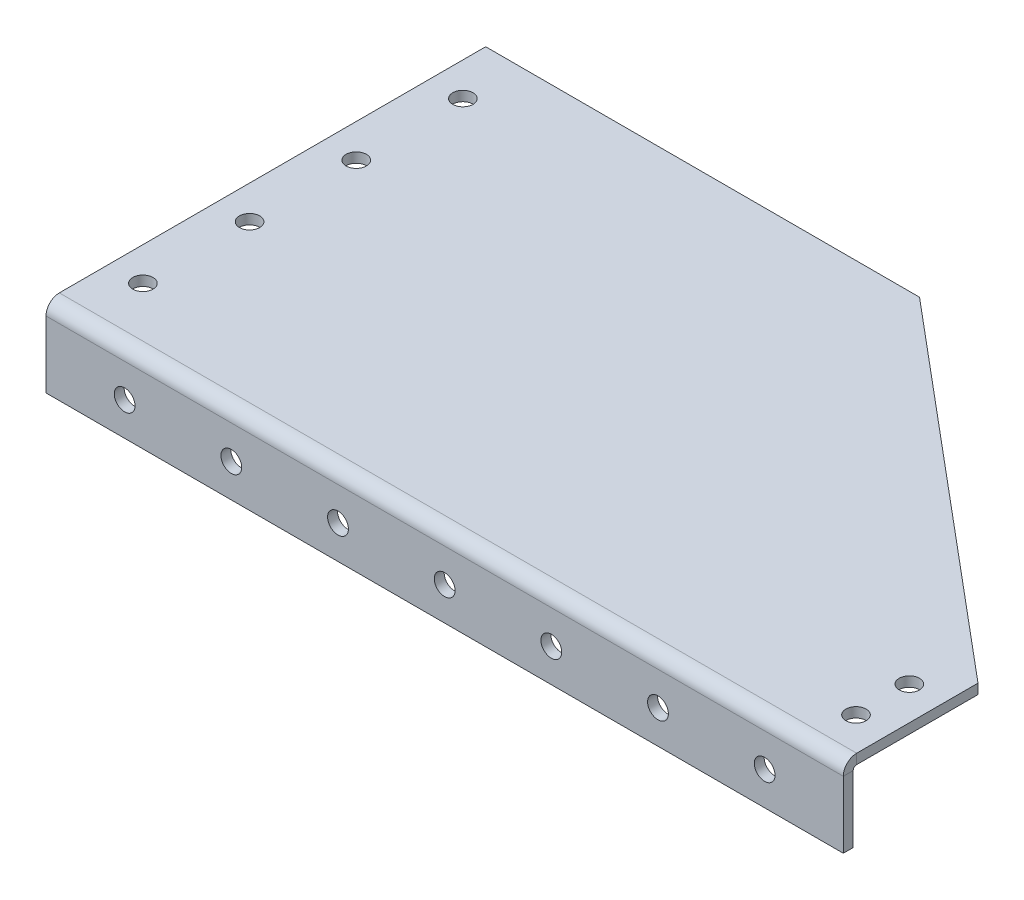
ISO-10303-21;
HEADER;
FILE_DESCRIPTION(('STEP AP214'),'2;1');
FILE_NAME('part.step','',(''),(''),'','','');
FILE_SCHEMA(('AUTOMOTIVE_DESIGN { 1 0 10303 214 1 1 1 1 }'));
ENDSEC;
DATA;
#1=APPLICATION_CONTEXT('core data for automotive mechanical design processes');
#2=APPLICATION_PROTOCOL_DEFINITION('international standard','automotive_design',2000,#1);
#3=PRODUCT_CONTEXT('',#1,'mechanical');
#4=PRODUCT('Part','Part','',(#3));
#5=PRODUCT_RELATED_PRODUCT_CATEGORY('part','',(#4));
#6=PRODUCT_DEFINITION_FORMATION('','',#4);
#7=PRODUCT_DEFINITION_CONTEXT('part definition',#1,'design');
#8=PRODUCT_DEFINITION('design','',#6,#7);
#9=PRODUCT_DEFINITION_SHAPE('','',#8);
#10=(LENGTH_UNIT() NAMED_UNIT(*) SI_UNIT(.MILLI.,.METRE.));
#11=(NAMED_UNIT(*) PLANE_ANGLE_UNIT() SI_UNIT($,.RADIAN.));
#12=(NAMED_UNIT(*) SI_UNIT($,.STERADIAN.) SOLID_ANGLE_UNIT());
#13=UNCERTAINTY_MEASURE_WITH_UNIT(LENGTH_MEASURE(1.E-05),#10,'distance_accuracy_value','');
#14=(GEOMETRIC_REPRESENTATION_CONTEXT(3) GLOBAL_UNCERTAINTY_ASSIGNED_CONTEXT((#13)) GLOBAL_UNIT_ASSIGNED_CONTEXT((#10,
#11,#12)) REPRESENTATION_CONTEXT('',''));
#15=CARTESIAN_POINT('',(0.,0.,0.));
#16=DIRECTION('',(0.,0.,1.));
#17=DIRECTION('',(1.,0.,0.));
#18=AXIS2_PLACEMENT_3D('',#15,#16,#17);
#19=CARTESIAN_POINT('',(-82.3158000000124,-2.3622,80.6769999999986));
#20=DIRECTION('',(-1.,0.,0.));
#21=DIRECTION('',(0.,0.,1.));
#22=AXIS2_PLACEMENT_3D('',#19,#20,#21);
#23=PLANE('',#22);
#24=DIRECTION('',(0.,0.,1.));
#25=VECTOR('',#24,1.);
#26=CARTESIAN_POINT('',(-82.3158000000124,0.,80.6769999999986));
#27=LINE('',#26,#25);
#28=CARTESIAN_POINT('',(-82.3158000000124,0.,-21.6596000000015));
#29=VERTEX_POINT('',#28);
#30=CARTESIAN_POINT('',(-82.3158000000124,0.,79.8641999999986));
#31=VERTEX_POINT('',#30);
#32=EDGE_CURVE('E195',#29,#31,#27,.T.);
#33=ORIENTED_EDGE('',*,*,#32,.F.);
#34=DIRECTION('',(0.,-1.,0.));
#35=VECTOR('',#34,1.);
#36=CARTESIAN_POINT('',(-82.3158000000124,0.,-21.6596000000015));
#37=LINE('',#36,#35);
#38=CARTESIAN_POINT('',(-82.3158000000124,-2.3622,-21.6596000000015));
#39=VERTEX_POINT('',#38);
#40=EDGE_CURVE('E123',#29,#39,#37,.T.);
#41=ORIENTED_EDGE('',*,*,#40,.T.);
#42=DIRECTION('',(0.,0.,1.));
#43=VECTOR('',#42,1.);
#44=CARTESIAN_POINT('',(-82.3158000000124,-2.3622,80.6769999999986));
#45=LINE('',#44,#43);
#46=CARTESIAN_POINT('',(-82.3158000000124,-2.36220000000001,79.8641999999985));
#47=VERTEX_POINT('',#46);
#48=EDGE_CURVE('E53',#39,#47,#45,.T.);
#49=ORIENTED_EDGE('',*,*,#48,.T.);
#50=DIRECTION('',(0.,1.,0.));
#51=VECTOR('',#50,1.);
#52=CARTESIAN_POINT('',(-82.3158000000124,-2.36220000000001,79.8641999999985));
#53=LINE('',#52,#51);
#54=EDGE_CURVE('E183',#47,#31,#53,.T.);
#55=ORIENTED_EDGE('',*,*,#54,.T.);
#56=EDGE_LOOP('',(#33,#41,#49,#55));
#57=FACE_BOUND('',#56,.T.);
#58=ADVANCED_FACE('F45',(#57),#23,.T.);
#59=CARTESIAN_POINT('',(0.,-2.3622,0.));
#60=DIRECTION('',(0.,1.,0.));
#61=DIRECTION('',(0.,0.,1.));
#62=AXIS2_PLACEMENT_3D('',#59,#60,#61);
#63=PLANE('',#62);
#64=CARTESIAN_POINT('',(-74.3402000000077,-2.3622,-8.2596000000015));
#65=DIRECTION('',(0.,-1.,0.));
#66=DIRECTION('',(0.,0.,-1.));
#67=AXIS2_PLACEMENT_3D('',#64,#65,#66);
#68=CIRCLE('',#67,2.413);
#69=CARTESIAN_POINT('',(-74.3402000000077,-2.3622,-10.6726000000015));
#70=VERTEX_POINT('',#69);
#71=EDGE_CURVE('E327',#70,#70,#68,.T.);
#72=ORIENTED_EDGE('',*,*,#71,.F.);
#73=EDGE_LOOP('',(#72));
#74=FACE_BOUND('',#73,.T.);
#75=CARTESIAN_POINT('',(99.5658000000081,-2.3622,72.0432000000004));
#76=DIRECTION('',(0.,-1.,0.));
#77=DIRECTION('',(0.,0.,-1.));
#78=AXIS2_PLACEMENT_3D('',#75,#76,#77);
#79=CIRCLE('',#78,2.41299999999999);
#80=CARTESIAN_POINT('',(99.5658000000081,-2.3622,69.6302000000004));
#81=VERTEX_POINT('',#80);
#82=EDGE_CURVE('E338',#81,#81,#79,.T.);
#83=ORIENTED_EDGE('',*,*,#82,.F.);
#84=EDGE_LOOP('',(#83));
#85=FACE_BOUND('',#84,.T.);
#86=CARTESIAN_POINT('',(99.5658000000083,-2.3622,59.3432000000004));
#87=DIRECTION('',(0.,-1.,0.));
#88=DIRECTION('',(0.,0.,-1.));
#89=AXIS2_PLACEMENT_3D('',#86,#87,#88);
#90=CIRCLE('',#89,2.41299999999999);
#91=CARTESIAN_POINT('',(99.5658000000083,-2.3622,56.9302000000004));
#92=VERTEX_POINT('',#91);
#93=EDGE_CURVE('E337',#92,#92,#90,.T.);
#94=ORIENTED_EDGE('',*,*,#93,.F.);
#95=EDGE_LOOP('',(#94));
#96=FACE_BOUND('',#95,.T.);
#97=CARTESIAN_POINT('',(-74.3402000000085,-2.3622,67.9403999999985));
#98=DIRECTION('',(0.,-1.,0.));
#99=DIRECTION('',(0.,0.,-1.));
#100=AXIS2_PLACEMENT_3D('',#97,#98,#99);
#101=CIRCLE('',#100,2.41299999999999);
#102=CARTESIAN_POINT('',(-74.3402000000085,-2.3622,65.5273999999985));
#103=VERTEX_POINT('',#102);
#104=EDGE_CURVE('E355',#103,#103,#101,.T.);
#105=ORIENTED_EDGE('',*,*,#104,.F.);
#106=EDGE_LOOP('',(#105));
#107=FACE_BOUND('',#106,.T.);
#108=CARTESIAN_POINT('',(-74.3402000000082,-2.3622,42.5403999999985));
#109=DIRECTION('',(0.,-1.,0.));
#110=DIRECTION('',(0.,0.,-1.));
#111=AXIS2_PLACEMENT_3D('',#108,#109,#110);
#112=CIRCLE('',#111,2.41299999999999);
#113=CARTESIAN_POINT('',(-74.3402000000082,-2.3622,40.1273999999985));
#114=VERTEX_POINT('',#113);
#115=EDGE_CURVE('E349',#114,#114,#112,.T.);
#116=ORIENTED_EDGE('',*,*,#115,.F.);
#117=EDGE_LOOP('',(#116));
#118=FACE_BOUND('',#117,.T.);
#119=CARTESIAN_POINT('',(-74.340200000008,-2.3622,17.1403999999985));
#120=DIRECTION('',(0.,-1.,0.));
#121=DIRECTION('',(0.,0.,-1.));
#122=AXIS2_PLACEMENT_3D('',#119,#120,#121);
#123=CIRCLE('',#122,2.413);
#124=CARTESIAN_POINT('',(-74.340200000008,-2.3622,14.7273999999985));
#125=VERTEX_POINT('',#124);
#126=EDGE_CURVE('E343',#125,#125,#123,.T.);
#127=ORIENTED_EDGE('',*,*,#126,.F.);
#128=EDGE_LOOP('',(#127));
#129=FACE_BOUND('',#128,.T.);
#130=DIRECTION('',(0.766044443118979,0.,0.642787609686538));
#131=VECTOR('',#130,1.);
#132=CARTESIAN_POINT('',(19.3372412522365,-2.3622,-23.0452267332139));
#133=LINE('',#132,#131);
#134=CARTESIAN_POINT('',(20.9885668895371,-2.3622,-21.6596000000015));
#135=VERTEX_POINT('',#134);
#136=CARTESIAN_POINT('',(107.54140000001,-2.3622,50.966850340345));
#137=VERTEX_POINT('',#136);
#138=EDGE_CURVE('E129',#135,#137,#133,.T.);
#139=ORIENTED_EDGE('',*,*,#138,.T.);
#140=DIRECTION('',(0.,0.,-1.));
#141=VECTOR('',#140,1.);
#142=CARTESIAN_POINT('',(107.54140000001,-2.3622,80.6769999999985));
#143=LINE('',#142,#141);
#144=CARTESIAN_POINT('',(107.54140000001,-2.36220000000001,79.8641999999985));
#145=VERTEX_POINT('',#144);
#146=EDGE_CURVE('E11',#145,#137,#143,.T.);
#147=ORIENTED_EDGE('',*,*,#146,.F.);
#148=DIRECTION('',(-1.,0.,0.));
#149=VECTOR('',#148,1.);
#150=CARTESIAN_POINT('',(-82.3158000000124,-2.36220000000001,79.8641999999985));
#151=LINE('',#150,#149);
#152=EDGE_CURVE('E189',#47,#145,#151,.F.);
#153=ORIENTED_EDGE('',*,*,#152,.F.);
#154=ORIENTED_EDGE('',*,*,#48,.F.);
#155=DIRECTION('',(1.,0.,0.));
#156=VECTOR('',#155,1.);
#157=CARTESIAN_POINT('',(0.,-2.3622,-21.6596000000015));
#158=LINE('',#157,#156);
#159=EDGE_CURVE('E136',#39,#135,#158,.T.);
#160=ORIENTED_EDGE('',*,*,#159,.T.);
#161=EDGE_LOOP('',(#139,#147,#153,#154,#160));
#162=FACE_BOUND('',#161,.T.);
#163=ADVANCED_FACE('F209',(#74,#85,#96,#107,#118,#129,#162),#63,.F.);
#164=CARTESIAN_POINT('',(0.,0.,0.));
#165=DIRECTION('',(0.,1.,0.));
#166=DIRECTION('',(0.,0.,1.));
#167=AXIS2_PLACEMENT_3D('',#164,#165,#166);
#168=PLANE('',#167);
#169=CARTESIAN_POINT('',(-74.3402000000077,0.,-8.2596000000015));
#170=DIRECTION('',(0.,1.,0.));
#171=DIRECTION('',(0.,0.,1.));
#172=AXIS2_PLACEMENT_3D('',#169,#170,#171);
#173=CIRCLE('',#172,2.413);
#174=CARTESIAN_POINT('',(-74.3402000000077,0.,-5.8466000000015));
#175=VERTEX_POINT('',#174);
#176=EDGE_CURVE('E325',#175,#175,#173,.F.);
#177=ORIENTED_EDGE('',*,*,#176,.T.);
#178=EDGE_LOOP('',(#177));
#179=FACE_BOUND('',#178,.T.);
#180=CARTESIAN_POINT('',(99.5658000000081,0.,72.0432000000004));
#181=DIRECTION('',(0.,1.,0.));
#182=DIRECTION('',(0.,0.,1.));
#183=AXIS2_PLACEMENT_3D('',#180,#181,#182);
#184=CIRCLE('',#183,2.41299999999999);
#185=CARTESIAN_POINT('',(99.5658000000081,0.,74.4562000000004));
#186=VERTEX_POINT('',#185);
#187=EDGE_CURVE('E334',#186,#186,#184,.F.);
#188=ORIENTED_EDGE('',*,*,#187,.T.);
#189=EDGE_LOOP('',(#188));
#190=FACE_BOUND('',#189,.T.);
#191=CARTESIAN_POINT('',(99.5658000000083,0.,59.3432000000004));
#192=DIRECTION('',(0.,1.,0.));
#193=DIRECTION('',(0.,0.,1.));
#194=AXIS2_PLACEMENT_3D('',#191,#192,#193);
#195=CIRCLE('',#194,2.41299999999999);
#196=CARTESIAN_POINT('',(99.5658000000083,0.,61.7562000000004));
#197=VERTEX_POINT('',#196);
#198=EDGE_CURVE('E358',#197,#197,#195,.F.);
#199=ORIENTED_EDGE('',*,*,#198,.T.);
#200=EDGE_LOOP('',(#199));
#201=FACE_BOUND('',#200,.T.);
#202=CARTESIAN_POINT('',(-74.3402000000085,0.,67.9403999999985));
#203=DIRECTION('',(0.,1.,0.));
#204=DIRECTION('',(0.,0.,1.));
#205=AXIS2_PLACEMENT_3D('',#202,#203,#204);
#206=CIRCLE('',#205,2.41299999999999);
#207=CARTESIAN_POINT('',(-74.3402000000085,0.,70.3533999999985));
#208=VERTEX_POINT('',#207);
#209=EDGE_CURVE('E352',#208,#208,#206,.F.);
#210=ORIENTED_EDGE('',*,*,#209,.T.);
#211=EDGE_LOOP('',(#210));
#212=FACE_BOUND('',#211,.T.);
#213=CARTESIAN_POINT('',(-74.3402000000082,0.,42.5403999999985));
#214=DIRECTION('',(0.,1.,0.));
#215=DIRECTION('',(0.,0.,1.));
#216=AXIS2_PLACEMENT_3D('',#213,#214,#215);
#217=CIRCLE('',#216,2.41299999999999);
#218=CARTESIAN_POINT('',(-74.3402000000082,0.,44.9533999999985));
#219=VERTEX_POINT('',#218);
#220=EDGE_CURVE('E346',#219,#219,#217,.F.);
#221=ORIENTED_EDGE('',*,*,#220,.T.);
#222=EDGE_LOOP('',(#221));
#223=FACE_BOUND('',#222,.T.);
#224=CARTESIAN_POINT('',(-74.340200000008,0.,17.1403999999985));
#225=DIRECTION('',(0.,1.,0.));
#226=DIRECTION('',(0.,0.,1.));
#227=AXIS2_PLACEMENT_3D('',#224,#225,#226);
#228=CIRCLE('',#227,2.413);
#229=CARTESIAN_POINT('',(-74.340200000008,0.,19.5533999999985));
#230=VERTEX_POINT('',#229);
#231=EDGE_CURVE('E331',#230,#230,#228,.F.);
#232=ORIENTED_EDGE('',*,*,#231,.T.);
#233=EDGE_LOOP('',(#232));
#234=FACE_BOUND('',#233,.T.);
#235=DIRECTION('',(0.,0.,-1.));
#236=VECTOR('',#235,1.);
#237=CARTESIAN_POINT('',(107.54140000001,0.,80.6769999999985));
#238=LINE('',#237,#236);
#239=CARTESIAN_POINT('',(107.54140000001,0.,79.8641999999985));
#240=VERTEX_POINT('',#239);
#241=CARTESIAN_POINT('',(107.54140000001,0.,50.966850340345));
#242=VERTEX_POINT('',#241);
#243=EDGE_CURVE('E48',#240,#242,#238,.T.);
#244=ORIENTED_EDGE('',*,*,#243,.T.);
#245=DIRECTION('',(0.766044443118979,0.,0.642787609686538));
#246=VECTOR('',#245,1.);
#247=CARTESIAN_POINT('',(19.3372412522365,0.,-23.0452267332139));
#248=LINE('',#247,#246);
#249=CARTESIAN_POINT('',(20.9885668895371,0.,-21.6596000000015));
#250=VERTEX_POINT('',#249);
#251=EDGE_CURVE('E61',#250,#242,#248,.T.);
#252=ORIENTED_EDGE('',*,*,#251,.F.);
#253=DIRECTION('',(1.,0.,0.));
#254=VECTOR('',#253,1.);
#255=CARTESIAN_POINT('',(0.,0.,-21.6596000000015));
#256=LINE('',#255,#254);
#257=EDGE_CURVE('E118',#29,#250,#256,.T.);
#258=ORIENTED_EDGE('',*,*,#257,.F.);
#259=ORIENTED_EDGE('',*,*,#32,.T.);
#260=DIRECTION('',(-1.,0.,0.));
#261=VECTOR('',#260,1.);
#262=CARTESIAN_POINT('',(-82.3158000000124,0.,79.8641999999986));
#263=LINE('',#262,#261);
#264=EDGE_CURVE('E179',#31,#240,#263,.F.);
#265=ORIENTED_EDGE('',*,*,#264,.T.);
#266=EDGE_LOOP('',(#244,#252,#258,#259,#265));
#267=FACE_BOUND('',#266,.T.);
#268=ADVANCED_FACE('F133',(#179,#190,#201,#212,#223,#234,#267),#168,.T.);
#269=CARTESIAN_POINT('',(107.54140000001,-2.3622,80.6769999999985));
#270=DIRECTION('',(1.,0.,0.));
#271=DIRECTION('',(0.,0.,-1.));
#272=AXIS2_PLACEMENT_3D('',#269,#270,#271);
#273=PLANE('',#272);
#274=ORIENTED_EDGE('',*,*,#146,.T.);
#275=DIRECTION('',(0.,-1.,0.));
#276=VECTOR('',#275,1.);
#277=CARTESIAN_POINT('',(107.54140000001,0.,50.966850340345));
#278=LINE('',#277,#276);
#279=EDGE_CURVE('E145',#242,#137,#278,.T.);
#280=ORIENTED_EDGE('',*,*,#279,.F.);
#281=ORIENTED_EDGE('',*,*,#243,.F.);
#282=DIRECTION('',(0.,1.,0.));
#283=VECTOR('',#282,1.);
#284=CARTESIAN_POINT('',(107.54140000001,-2.36220000000001,79.8641999999985));
#285=LINE('',#284,#283);
#286=EDGE_CURVE('E193',#145,#240,#285,.T.);
#287=ORIENTED_EDGE('',*,*,#286,.F.);
#288=EDGE_LOOP('',(#274,#280,#281,#287));
#289=FACE_BOUND('',#288,.T.);
#290=ADVANCED_FACE('F219',(#289),#273,.T.);
#291=CARTESIAN_POINT('',(107.54140000001,-3.175,79.8641999999985));
#292=DIRECTION('',(1.,0.,0.));
#293=DIRECTION('',(0.,0.,-1.));
#294=AXIS2_PLACEMENT_3D('',#291,#292,#293);
#295=PLANE('',#294);
#296=DIRECTION('',(0.,0.,1.));
#297=VECTOR('',#296,1.);
#298=CARTESIAN_POINT('',(107.54140000001,-3.175,80.6769999999985));
#299=LINE('',#298,#297);
#300=CARTESIAN_POINT('',(107.54140000001,-3.17499999999999,80.6769999999985));
#301=VERTEX_POINT('',#300);
#302=CARTESIAN_POINT('',(107.54140000001,-3.17499999999999,83.0391999999985));
#303=VERTEX_POINT('',#302);
#304=EDGE_CURVE('E147',#301,#303,#299,.T.);
#305=ORIENTED_EDGE('',*,*,#304,.F.);
#306=CARTESIAN_POINT('',(107.54140000001,-3.175,79.8641999999985));
#307=DIRECTION('',(-1.,0.,0.));
#308=DIRECTION('',(0.,0.,1.));
#309=AXIS2_PLACEMENT_3D('',#306,#307,#308);
#310=CIRCLE('',#309,0.812799999999989);
#311=EDGE_CURVE('E186',#145,#301,#310,.F.);
#312=ORIENTED_EDGE('',*,*,#311,.F.);
#313=ORIENTED_EDGE('',*,*,#286,.T.);
#314=CARTESIAN_POINT('',(107.54140000001,-3.175,79.8641999999985));
#315=DIRECTION('',(-1.,0.,0.));
#316=DIRECTION('',(0.,0.,1.));
#317=AXIS2_PLACEMENT_3D('',#314,#315,#316);
#318=CIRCLE('',#317,3.17499999999999);
#319=EDGE_CURVE('E69',#240,#303,#318,.F.);
#320=ORIENTED_EDGE('',*,*,#319,.T.);
#321=EDGE_LOOP('',(#305,#312,#313,#320));
#322=FACE_BOUND('',#321,.T.);
#323=ADVANCED_FACE('F217',(#322),#295,.T.);
#324=CARTESIAN_POINT('',(-82.3158000000124,-3.175,79.8641999999985));
#325=DIRECTION('',(1.,0.,0.));
#326=DIRECTION('',(0.,0.,-1.));
#327=AXIS2_PLACEMENT_3D('',#324,#325,#326);
#328=PLANE('',#327);
#329=CARTESIAN_POINT('',(-82.3158000000124,-3.175,79.8641999999985));
#330=DIRECTION('',(-1.,0.,0.));
#331=DIRECTION('',(0.,0.,1.));
#332=AXIS2_PLACEMENT_3D('',#329,#330,#331);
#333=CIRCLE('',#332,0.812799999999989);
#334=CARTESIAN_POINT('',(-82.3158000000124,-3.17499999999999,80.6769999999985));
#335=VERTEX_POINT('',#334);
#336=EDGE_CURVE('E178',#335,#47,#333,.T.);
#337=ORIENTED_EDGE('',*,*,#336,.F.);
#338=DIRECTION('',(0.,0.,1.));
#339=VECTOR('',#338,1.);
#340=CARTESIAN_POINT('',(-82.3158000000124,-3.175,80.6769999999986));
#341=LINE('',#340,#339);
#342=CARTESIAN_POINT('',(-82.3158000000124,-3.175,83.0391999999985));
#343=VERTEX_POINT('',#342);
#344=EDGE_CURVE('E151',#335,#343,#341,.T.);
#345=ORIENTED_EDGE('',*,*,#344,.T.);
#346=CARTESIAN_POINT('',(-82.3158000000124,-3.175,79.8641999999985));
#347=DIRECTION('',(-1.,0.,0.));
#348=DIRECTION('',(0.,0.,1.));
#349=AXIS2_PLACEMENT_3D('',#346,#347,#348);
#350=CIRCLE('',#349,3.17499999999999);
#351=EDGE_CURVE('E181',#343,#31,#350,.T.);
#352=ORIENTED_EDGE('',*,*,#351,.T.);
#353=ORIENTED_EDGE('',*,*,#54,.F.);
#354=EDGE_LOOP('',(#337,#345,#352,#353));
#355=FACE_BOUND('',#354,.T.);
#356=ADVANCED_FACE('F203',(#355),#328,.F.);
#357=CARTESIAN_POINT('',(-82.3158000000124,-3.175,79.8641999999985));
#358=DIRECTION('',(-1.,0.,0.));
#359=DIRECTION('',(0.,0.,1.));
#360=AXIS2_PLACEMENT_3D('',#357,#358,#359);
#361=CYLINDRICAL_SURFACE('',#360,3.17499999999999);
#362=ORIENTED_EDGE('',*,*,#264,.F.);
#363=ORIENTED_EDGE('',*,*,#351,.F.);
#364=DIRECTION('',(1.,0.,0.));
#365=VECTOR('',#364,1.);
#366=CARTESIAN_POINT('',(0.,-3.175,83.0391999999985));
#367=LINE('',#366,#365);
#368=EDGE_CURVE('E154',#343,#303,#367,.T.);
#369=ORIENTED_EDGE('',*,*,#368,.T.);
#370=ORIENTED_EDGE('',*,*,#319,.F.);
#371=EDGE_LOOP('',(#362,#363,#369,#370));
#372=FACE_BOUND('',#371,.T.);
#373=ADVANCED_FACE('F199',(#372),#361,.T.);
#374=CARTESIAN_POINT('',(-82.3158000000124,-3.175,79.8641999999985));
#375=DIRECTION('',(-1.,0.,0.));
#376=DIRECTION('',(0.,0.,1.));
#377=AXIS2_PLACEMENT_3D('',#374,#375,#376);
#378=CYLINDRICAL_SURFACE('',#377,0.812799999999989);
#379=ORIENTED_EDGE('',*,*,#152,.T.);
#380=ORIENTED_EDGE('',*,*,#311,.T.);
#381=DIRECTION('',(-1.,0.,0.));
#382=VECTOR('',#381,1.);
#383=CARTESIAN_POINT('',(107.54140000001,-3.175,80.6769999999985));
#384=LINE('',#383,#382);
#385=EDGE_CURVE('E149',#301,#335,#384,.T.);
#386=ORIENTED_EDGE('',*,*,#385,.T.);
#387=ORIENTED_EDGE('',*,*,#336,.T.);
#388=EDGE_LOOP('',(#379,#380,#386,#387));
#389=FACE_BOUND('',#388,.T.);
#390=ADVANCED_FACE('F213',(#389),#378,.F.);
#391=CARTESIAN_POINT('',(-82.3158000000124,-19.05,83.0391999999986));
#392=DIRECTION('',(1.,0.,0.));
#393=DIRECTION('',(0.,1.,0.));
#394=AXIS2_PLACEMENT_3D('',#391,#392,#393);
#395=PLANE('',#394);
#396=ORIENTED_EDGE('',*,*,#344,.F.);
#397=DIRECTION('',(0.,-1.,0.));
#398=VECTOR('',#397,1.);
#399=CARTESIAN_POINT('',(-82.3158000000124,-19.05,80.6769999999986));
#400=LINE('',#399,#398);
#401=CARTESIAN_POINT('',(-82.3158000000124,-19.05,80.6769999999986));
#402=VERTEX_POINT('',#401);
#403=EDGE_CURVE('E158',#335,#402,#400,.T.);
#404=ORIENTED_EDGE('',*,*,#403,.T.);
#405=DIRECTION('',(0.,0.,-1.));
#406=VECTOR('',#405,1.);
#407=CARTESIAN_POINT('',(-82.3158000000124,-19.05,83.0391999999986));
#408=LINE('',#407,#406);
#409=CARTESIAN_POINT('',(-82.3158000000124,-19.05,83.0391999999986));
#410=VERTEX_POINT('',#409);
#411=EDGE_CURVE('E175',#410,#402,#408,.T.);
#412=ORIENTED_EDGE('',*,*,#411,.F.);
#413=DIRECTION('',(0.,-1.,0.));
#414=VECTOR('',#413,1.);
#415=CARTESIAN_POINT('',(-82.3158000000124,-19.05,83.0391999999986));
#416=LINE('',#415,#414);
#417=EDGE_CURVE('E159',#343,#410,#416,.T.);
#418=ORIENTED_EDGE('',*,*,#417,.F.);
#419=EDGE_LOOP('',(#396,#404,#412,#418));
#420=FACE_BOUND('',#419,.T.);
#421=ADVANCED_FACE('F246',(#420),#395,.F.);
#422=CARTESIAN_POINT('',(107.54140000001,-2.36219999999999,83.0391999999985));
#423=DIRECTION('',(-1.,0.,0.));
#424=DIRECTION('',(0.,0.,1.));
#425=AXIS2_PLACEMENT_3D('',#422,#423,#424);
#426=PLANE('',#425);
#427=ORIENTED_EDGE('',*,*,#304,.T.);
#428=DIRECTION('',(0.,1.,0.));
#429=VECTOR('',#428,1.);
#430=CARTESIAN_POINT('',(107.54140000001,-2.36219999999999,83.0391999999985));
#431=LINE('',#430,#429);
#432=CARTESIAN_POINT('',(107.54140000001,-19.05,83.0391999999986));
#433=VERTEX_POINT('',#432);
#434=EDGE_CURVE('E164',#433,#303,#431,.T.);
#435=ORIENTED_EDGE('',*,*,#434,.F.);
#436=DIRECTION('',(0.,0.,-1.));
#437=VECTOR('',#436,1.);
#438=CARTESIAN_POINT('',(107.54140000001,-19.05,83.0391999999986));
#439=LINE('',#438,#437);
#440=CARTESIAN_POINT('',(107.54140000001,-19.05,80.6769999999986));
#441=VERTEX_POINT('',#440);
#442=EDGE_CURVE('E167',#433,#441,#439,.T.);
#443=ORIENTED_EDGE('',*,*,#442,.T.);
#444=DIRECTION('',(0.,1.,0.));
#445=VECTOR('',#444,1.);
#446=CARTESIAN_POINT('',(107.54140000001,-2.3622,80.6769999999985));
#447=LINE('',#446,#445);
#448=EDGE_CURVE('E162',#441,#301,#447,.T.);
#449=ORIENTED_EDGE('',*,*,#448,.T.);
#450=EDGE_LOOP('',(#427,#435,#443,#449));
#451=FACE_BOUND('',#450,.T.);
#452=ADVANCED_FACE('F251',(#451),#426,.F.);
#453=CARTESIAN_POINT('',(0.,2.76615675343239E-13,83.0391999999985));
#454=DIRECTION('',(0.,0.,-1.));
#455=DIRECTION('',(0.,1.,0.));
#456=AXIS2_PLACEMENT_3D('',#453,#454,#455);
#457=PLANE('',#456);
#458=CARTESIAN_POINT('',(-63.587200000001,-11.1125,83.0391999999986));
#459=DIRECTION('',(0.,0.,-1.));
#460=DIRECTION('',(0.,1.,0.));
#461=AXIS2_PLACEMENT_3D('',#458,#459,#460);
#462=CIRCLE('',#461,2.4765);
#463=CARTESIAN_POINT('',(-63.587200000001,-8.636,83.0391999999986));
#464=VERTEX_POINT('',#463);
#465=EDGE_CURVE('E143',#464,#464,#462,.F.);
#466=ORIENTED_EDGE('',*,*,#465,.F.);
#467=EDGE_LOOP('',(#466));
#468=FACE_BOUND('',#467,.T.);
#469=CARTESIAN_POINT('',(88.812799999999,-11.1125,83.0391999999986));
#470=DIRECTION('',(0.,0.,-1.));
#471=DIRECTION('',(0.,1.,0.));
#472=AXIS2_PLACEMENT_3D('',#469,#470,#471);
#473=CIRCLE('',#472,2.4765);
#474=CARTESIAN_POINT('',(88.812799999999,-8.636,83.0391999999985));
#475=VERTEX_POINT('',#474);
#476=EDGE_CURVE('E369',#475,#475,#473,.F.);
#477=ORIENTED_EDGE('',*,*,#476,.F.);
#478=EDGE_LOOP('',(#477));
#479=FACE_BOUND('',#478,.T.);
#480=CARTESIAN_POINT('',(63.412799999999,-11.1125,83.0391999999986));
#481=DIRECTION('',(0.,0.,-1.));
#482=DIRECTION('',(0.,1.,0.));
#483=AXIS2_PLACEMENT_3D('',#480,#481,#482);
#484=CIRCLE('',#483,2.4765);
#485=CARTESIAN_POINT('',(63.412799999999,-8.63600000000001,83.0391999999985));
#486=VERTEX_POINT('',#485);
#487=EDGE_CURVE('E375',#486,#486,#484,.F.);
#488=ORIENTED_EDGE('',*,*,#487,.F.);
#489=EDGE_LOOP('',(#488));
#490=FACE_BOUND('',#489,.T.);
#491=CARTESIAN_POINT('',(38.012799999999,-11.1125,83.0391999999986));
#492=DIRECTION('',(0.,0.,-1.));
#493=DIRECTION('',(0.,1.,0.));
#494=AXIS2_PLACEMENT_3D('',#491,#492,#493);
#495=CIRCLE('',#494,2.4765);
#496=CARTESIAN_POINT('',(38.012799999999,-8.63600000000001,83.0391999999985));
#497=VERTEX_POINT('',#496);
#498=EDGE_CURVE('E381',#497,#497,#495,.F.);
#499=ORIENTED_EDGE('',*,*,#498,.F.);
#500=EDGE_LOOP('',(#499));
#501=FACE_BOUND('',#500,.T.);
#502=CARTESIAN_POINT('',(12.612799999999,-11.1125,83.0391999999986));
#503=DIRECTION('',(0.,0.,-1.));
#504=DIRECTION('',(0.,1.,0.));
#505=AXIS2_PLACEMENT_3D('',#502,#503,#504);
#506=CIRCLE('',#505,2.4765);
#507=CARTESIAN_POINT('',(12.612799999999,-8.636,83.0391999999986));
#508=VERTEX_POINT('',#507);
#509=EDGE_CURVE('E387',#508,#508,#506,.F.);
#510=ORIENTED_EDGE('',*,*,#509,.F.);
#511=EDGE_LOOP('',(#510));
#512=FACE_BOUND('',#511,.T.);
#513=CARTESIAN_POINT('',(-12.787200000001,-11.1125,83.0391999999986));
#514=DIRECTION('',(0.,0.,-1.));
#515=DIRECTION('',(0.,1.,0.));
#516=AXIS2_PLACEMENT_3D('',#513,#514,#515);
#517=CIRCLE('',#516,2.4765);
#518=CARTESIAN_POINT('',(-12.787200000001,-8.636,83.0391999999986));
#519=VERTEX_POINT('',#518);
#520=EDGE_CURVE('E393',#519,#519,#517,.F.);
#521=ORIENTED_EDGE('',*,*,#520,.F.);
#522=EDGE_LOOP('',(#521));
#523=FACE_BOUND('',#522,.T.);
#524=CARTESIAN_POINT('',(-38.187200000001,-11.1125,83.0391999999986));
#525=DIRECTION('',(0.,0.,-1.));
#526=DIRECTION('',(0.,1.,0.));
#527=AXIS2_PLACEMENT_3D('',#524,#525,#526);
#528=CIRCLE('',#527,2.4765);
#529=CARTESIAN_POINT('',(-38.187200000001,-8.63600000000001,83.0391999999986));
#530=VERTEX_POINT('',#529);
#531=EDGE_CURVE('E328',#530,#530,#528,.F.);
#532=ORIENTED_EDGE('',*,*,#531,.F.);
#533=EDGE_LOOP('',(#532));
#534=FACE_BOUND('',#533,.T.);
#535=ORIENTED_EDGE('',*,*,#368,.F.);
#536=ORIENTED_EDGE('',*,*,#417,.T.);
#537=DIRECTION('',(1.,0.,0.));
#538=VECTOR('',#537,1.);
#539=CARTESIAN_POINT('',(107.54140000001,-19.05,83.0391999999986));
#540=LINE('',#539,#538);
#541=EDGE_CURVE('E161',#410,#433,#540,.T.);
#542=ORIENTED_EDGE('',*,*,#541,.T.);
#543=ORIENTED_EDGE('',*,*,#434,.T.);
#544=EDGE_LOOP('',(#535,#536,#542,#543));
#545=FACE_BOUND('',#544,.T.);
#546=ADVANCED_FACE('F259',(#468,#479,#490,#501,#512,#523,#534,#545),#457,.F.);
#547=CARTESIAN_POINT('',(0.,2.68368098124624E-13,80.6769999999985));
#548=DIRECTION('',(0.,0.,-1.));
#549=DIRECTION('',(0.,1.,0.));
#550=AXIS2_PLACEMENT_3D('',#547,#548,#549);
#551=PLANE('',#550);
#552=CARTESIAN_POINT('',(-63.587200000001,-11.1125,80.6769999999986));
#553=DIRECTION('',(0.,0.,-1.));
#554=DIRECTION('',(0.,1.,0.));
#555=AXIS2_PLACEMENT_3D('',#552,#553,#554);
#556=CIRCLE('',#555,2.4765);
#557=CARTESIAN_POINT('',(-63.587200000001,-8.63600000000001,80.6769999999986));
#558=VERTEX_POINT('',#557);
#559=EDGE_CURVE('E363',#558,#558,#556,.T.);
#560=ORIENTED_EDGE('',*,*,#559,.F.);
#561=EDGE_LOOP('',(#560));
#562=FACE_BOUND('',#561,.T.);
#563=CARTESIAN_POINT('',(88.812799999999,-11.1125,80.6769999999986));
#564=DIRECTION('',(0.,0.,-1.));
#565=DIRECTION('',(0.,1.,0.));
#566=AXIS2_PLACEMENT_3D('',#563,#564,#565);
#567=CIRCLE('',#566,2.4765);
#568=CARTESIAN_POINT('',(88.812799999999,-8.63600000000001,80.6769999999986));
#569=VERTEX_POINT('',#568);
#570=EDGE_CURVE('E366',#569,#569,#567,.T.);
#571=ORIENTED_EDGE('',*,*,#570,.F.);
#572=EDGE_LOOP('',(#571));
#573=FACE_BOUND('',#572,.T.);
#574=CARTESIAN_POINT('',(63.412799999999,-11.1125,80.6769999999986));
#575=DIRECTION('',(0.,0.,-1.));
#576=DIRECTION('',(0.,1.,0.));
#577=AXIS2_PLACEMENT_3D('',#574,#575,#576);
#578=CIRCLE('',#577,2.4765);
#579=CARTESIAN_POINT('',(63.412799999999,-8.63600000000002,80.6769999999986));
#580=VERTEX_POINT('',#579);
#581=EDGE_CURVE('E372',#580,#580,#578,.T.);
#582=ORIENTED_EDGE('',*,*,#581,.F.);
#583=EDGE_LOOP('',(#582));
#584=FACE_BOUND('',#583,.T.);
#585=CARTESIAN_POINT('',(38.012799999999,-11.1125,80.6769999999986));
#586=DIRECTION('',(0.,0.,-1.));
#587=DIRECTION('',(0.,1.,0.));
#588=AXIS2_PLACEMENT_3D('',#585,#586,#587);
#589=CIRCLE('',#588,2.4765);
#590=CARTESIAN_POINT('',(38.012799999999,-8.63600000000002,80.6769999999986));
#591=VERTEX_POINT('',#590);
#592=EDGE_CURVE('E378',#591,#591,#589,.T.);
#593=ORIENTED_EDGE('',*,*,#592,.F.);
#594=EDGE_LOOP('',(#593));
#595=FACE_BOUND('',#594,.T.);
#596=CARTESIAN_POINT('',(12.612799999999,-11.1125,80.6769999999986));
#597=DIRECTION('',(0.,0.,-1.));
#598=DIRECTION('',(0.,1.,0.));
#599=AXIS2_PLACEMENT_3D('',#596,#597,#598);
#600=CIRCLE('',#599,2.4765);
#601=CARTESIAN_POINT('',(12.612799999999,-8.63600000000001,80.6769999999986));
#602=VERTEX_POINT('',#601);
#603=EDGE_CURVE('E384',#602,#602,#600,.T.);
#604=ORIENTED_EDGE('',*,*,#603,.F.);
#605=EDGE_LOOP('',(#604));
#606=FACE_BOUND('',#605,.T.);
#607=CARTESIAN_POINT('',(-12.787200000001,-11.1125,80.6769999999986));
#608=DIRECTION('',(0.,0.,-1.));
#609=DIRECTION('',(0.,1.,0.));
#610=AXIS2_PLACEMENT_3D('',#607,#608,#609);
#611=CIRCLE('',#610,2.4765);
#612=CARTESIAN_POINT('',(-12.787200000001,-8.63600000000001,80.6769999999986));
#613=VERTEX_POINT('',#612);
#614=EDGE_CURVE('E390',#613,#613,#611,.T.);
#615=ORIENTED_EDGE('',*,*,#614,.F.);
#616=EDGE_LOOP('',(#615));
#617=FACE_BOUND('',#616,.T.);
#618=CARTESIAN_POINT('',(-38.187200000001,-11.1125,80.6769999999986));
#619=DIRECTION('',(0.,0.,-1.));
#620=DIRECTION('',(0.,1.,0.));
#621=AXIS2_PLACEMENT_3D('',#618,#619,#620);
#622=CIRCLE('',#621,2.4765);
#623=CARTESIAN_POINT('',(-38.187200000001,-8.63600000000002,80.6769999999986));
#624=VERTEX_POINT('',#623);
#625=EDGE_CURVE('E140',#624,#624,#622,.T.);
#626=ORIENTED_EDGE('',*,*,#625,.F.);
#627=EDGE_LOOP('',(#626));
#628=FACE_BOUND('',#627,.T.);
#629=ORIENTED_EDGE('',*,*,#403,.F.);
#630=ORIENTED_EDGE('',*,*,#385,.F.);
#631=ORIENTED_EDGE('',*,*,#448,.F.);
#632=DIRECTION('',(1.,0.,0.));
#633=VECTOR('',#632,1.);
#634=CARTESIAN_POINT('',(107.54140000001,-19.05,80.6769999999986));
#635=LINE('',#634,#633);
#636=EDGE_CURVE('E169',#402,#441,#635,.T.);
#637=ORIENTED_EDGE('',*,*,#636,.F.);
#638=EDGE_LOOP('',(#629,#630,#631,#637));
#639=FACE_BOUND('',#638,.T.);
#640=ADVANCED_FACE('F255',(#562,#573,#584,#595,#606,#617,#628,#639),#551,.T.);
#641=CARTESIAN_POINT('',(107.54140000001,-19.05,83.0391999999986));
#642=DIRECTION('',(0.,1.,0.));
#643=DIRECTION('',(0.,0.,1.));
#644=AXIS2_PLACEMENT_3D('',#641,#642,#643);
#645=PLANE('',#644);
#646=ORIENTED_EDGE('',*,*,#636,.T.);
#647=ORIENTED_EDGE('',*,*,#442,.F.);
#648=ORIENTED_EDGE('',*,*,#541,.F.);
#649=ORIENTED_EDGE('',*,*,#411,.T.);
#650=EDGE_LOOP('',(#646,#647,#648,#649));
#651=FACE_BOUND('',#650,.T.);
#652=ADVANCED_FACE('F253',(#651),#645,.F.);
#653=CARTESIAN_POINT('',(19.3372412522365,0.,-23.0452267332139));
#654=DIRECTION('',(0.642787609686538,0.,-0.766044443118979));
#655=DIRECTION('',(-0.766044443118979,0.,-0.642787609686538));
#656=AXIS2_PLACEMENT_3D('',#653,#654,#655);
#657=PLANE('',#656);
#658=ORIENTED_EDGE('',*,*,#138,.F.);
#659=DIRECTION('',(0.,-1.,0.));
#660=VECTOR('',#659,1.);
#661=CARTESIAN_POINT('',(20.9885668895371,0.,-21.6596000000015));
#662=LINE('',#661,#660);
#663=EDGE_CURVE('E120',#250,#135,#662,.T.);
#664=ORIENTED_EDGE('',*,*,#663,.F.);
#665=ORIENTED_EDGE('',*,*,#251,.T.);
#666=ORIENTED_EDGE('',*,*,#279,.T.);
#667=EDGE_LOOP('',(#658,#664,#665,#666));
#668=FACE_BOUND('',#667,.T.);
#669=ADVANCED_FACE('F127',(#668),#657,.T.);
#670=CARTESIAN_POINT('',(0.,0.,-21.6596000000015));
#671=DIRECTION('',(0.,0.,-1.));
#672=DIRECTION('',(-1.,0.,0.));
#673=AXIS2_PLACEMENT_3D('',#670,#671,#672);
#674=PLANE('',#673);
#675=ORIENTED_EDGE('',*,*,#159,.F.);
#676=ORIENTED_EDGE('',*,*,#40,.F.);
#677=ORIENTED_EDGE('',*,*,#257,.T.);
#678=ORIENTED_EDGE('',*,*,#663,.T.);
#679=EDGE_LOOP('',(#675,#676,#677,#678));
#680=FACE_BOUND('',#679,.T.);
#681=ADVANCED_FACE('F119',(#680),#674,.T.);
#682=CARTESIAN_POINT('',(-38.187200000001,-11.1125,83.0401999999987));
#683=DIRECTION('',(0.,0.,-1.));
#684=DIRECTION('',(0.,1.,0.));
#685=AXIS2_PLACEMENT_3D('',#682,#683,#684);
#686=CYLINDRICAL_SURFACE('',#685,2.4765);
#687=ORIENTED_EDGE('',*,*,#625,.T.);
#688=EDGE_LOOP('',(#687));
#689=FACE_BOUND('',#688,.T.);
#690=ORIENTED_EDGE('',*,*,#531,.T.);
#691=EDGE_LOOP('',(#690));
#692=FACE_BOUND('',#691,.T.);
#693=ADVANCED_FACE('F270',(#689,#692),#686,.F.);
#694=CARTESIAN_POINT('',(-12.787200000001,-11.1125,83.0401999999987));
#695=DIRECTION('',(0.,0.,-1.));
#696=DIRECTION('',(0.,1.,0.));
#697=AXIS2_PLACEMENT_3D('',#694,#695,#696);
#698=CYLINDRICAL_SURFACE('',#697,2.4765);
#699=ORIENTED_EDGE('',*,*,#614,.T.);
#700=EDGE_LOOP('',(#699));
#701=FACE_BOUND('',#700,.T.);
#702=ORIENTED_EDGE('',*,*,#520,.T.);
#703=EDGE_LOOP('',(#702));
#704=FACE_BOUND('',#703,.T.);
#705=ADVANCED_FACE('F273',(#701,#704),#698,.F.);
#706=CARTESIAN_POINT('',(12.612799999999,-11.1125,83.0401999999987));
#707=DIRECTION('',(0.,0.,-1.));
#708=DIRECTION('',(0.,1.,0.));
#709=AXIS2_PLACEMENT_3D('',#706,#707,#708);
#710=CYLINDRICAL_SURFACE('',#709,2.4765);
#711=ORIENTED_EDGE('',*,*,#603,.T.);
#712=EDGE_LOOP('',(#711));
#713=FACE_BOUND('',#712,.T.);
#714=ORIENTED_EDGE('',*,*,#509,.T.);
#715=EDGE_LOOP('',(#714));
#716=FACE_BOUND('',#715,.T.);
#717=ADVANCED_FACE('F277',(#713,#716),#710,.F.);
#718=CARTESIAN_POINT('',(38.012799999999,-11.1125,83.0401999999987));
#719=DIRECTION('',(0.,0.,-1.));
#720=DIRECTION('',(0.,1.,0.));
#721=AXIS2_PLACEMENT_3D('',#718,#719,#720);
#722=CYLINDRICAL_SURFACE('',#721,2.4765);
#723=ORIENTED_EDGE('',*,*,#592,.T.);
#724=EDGE_LOOP('',(#723));
#725=FACE_BOUND('',#724,.T.);
#726=ORIENTED_EDGE('',*,*,#498,.T.);
#727=EDGE_LOOP('',(#726));
#728=FACE_BOUND('',#727,.T.);
#729=ADVANCED_FACE('F281',(#725,#728),#722,.F.);
#730=CARTESIAN_POINT('',(63.412799999999,-11.1125,83.0401999999987));
#731=DIRECTION('',(0.,0.,-1.));
#732=DIRECTION('',(0.,1.,0.));
#733=AXIS2_PLACEMENT_3D('',#730,#731,#732);
#734=CYLINDRICAL_SURFACE('',#733,2.4765);
#735=ORIENTED_EDGE('',*,*,#581,.T.);
#736=EDGE_LOOP('',(#735));
#737=FACE_BOUND('',#736,.T.);
#738=ORIENTED_EDGE('',*,*,#487,.T.);
#739=EDGE_LOOP('',(#738));
#740=FACE_BOUND('',#739,.T.);
#741=ADVANCED_FACE('F285',(#737,#740),#734,.F.);
#742=CARTESIAN_POINT('',(88.812799999999,-11.1125,83.0401999999987));
#743=DIRECTION('',(0.,0.,-1.));
#744=DIRECTION('',(0.,1.,0.));
#745=AXIS2_PLACEMENT_3D('',#742,#743,#744);
#746=CYLINDRICAL_SURFACE('',#745,2.4765);
#747=ORIENTED_EDGE('',*,*,#570,.T.);
#748=EDGE_LOOP('',(#747));
#749=FACE_BOUND('',#748,.T.);
#750=ORIENTED_EDGE('',*,*,#476,.T.);
#751=EDGE_LOOP('',(#750));
#752=FACE_BOUND('',#751,.T.);
#753=ADVANCED_FACE('F289',(#749,#752),#746,.F.);
#754=CARTESIAN_POINT('',(-63.587200000001,-11.1125,83.0401999999987));
#755=DIRECTION('',(0.,0.,-1.));
#756=DIRECTION('',(0.,1.,0.));
#757=AXIS2_PLACEMENT_3D('',#754,#755,#756);
#758=CYLINDRICAL_SURFACE('',#757,2.4765);
#759=ORIENTED_EDGE('',*,*,#559,.T.);
#760=EDGE_LOOP('',(#759));
#761=FACE_BOUND('',#760,.T.);
#762=ORIENTED_EDGE('',*,*,#465,.T.);
#763=EDGE_LOOP('',(#762));
#764=FACE_BOUND('',#763,.T.);
#765=ADVANCED_FACE('F293',(#761,#764),#758,.F.);
#766=CARTESIAN_POINT('',(-74.340200000008,0.00100000000000013,17.1403999999985));
#767=DIRECTION('',(0.,-1.,0.));
#768=DIRECTION('',(0.,0.,-1.));
#769=AXIS2_PLACEMENT_3D('',#766,#767,#768);
#770=CYLINDRICAL_SURFACE('',#769,2.413);
#771=ORIENTED_EDGE('',*,*,#231,.F.);
#772=EDGE_LOOP('',(#771));
#773=FACE_BOUND('',#772,.T.);
#774=ORIENTED_EDGE('',*,*,#126,.T.);
#775=EDGE_LOOP('',(#774));
#776=FACE_BOUND('',#775,.T.);
#777=ADVANCED_FACE('F296',(#773,#776),#770,.F.);
#778=CARTESIAN_POINT('',(-74.3402000000082,0.00100000000000013,42.5403999999985));
#779=DIRECTION('',(0.,-1.,0.));
#780=DIRECTION('',(0.,0.,-1.));
#781=AXIS2_PLACEMENT_3D('',#778,#779,#780);
#782=CYLINDRICAL_SURFACE('',#781,2.41299999999999);
#783=ORIENTED_EDGE('',*,*,#220,.F.);
#784=EDGE_LOOP('',(#783));
#785=FACE_BOUND('',#784,.T.);
#786=ORIENTED_EDGE('',*,*,#115,.T.);
#787=EDGE_LOOP('',(#786));
#788=FACE_BOUND('',#787,.T.);
#789=ADVANCED_FACE('F306',(#785,#788),#782,.F.);
#790=CARTESIAN_POINT('',(-74.3402000000085,0.00100000000000013,67.9403999999985));
#791=DIRECTION('',(0.,-1.,0.));
#792=DIRECTION('',(0.,0.,-1.));
#793=AXIS2_PLACEMENT_3D('',#790,#791,#792);
#794=CYLINDRICAL_SURFACE('',#793,2.41299999999999);
#795=ORIENTED_EDGE('',*,*,#209,.F.);
#796=EDGE_LOOP('',(#795));
#797=FACE_BOUND('',#796,.T.);
#798=ORIENTED_EDGE('',*,*,#104,.T.);
#799=EDGE_LOOP('',(#798));
#800=FACE_BOUND('',#799,.T.);
#801=ADVANCED_FACE('F302',(#797,#800),#794,.F.);
#802=CARTESIAN_POINT('',(99.5658000000083,0.00100000000000013,59.3432000000004));
#803=DIRECTION('',(0.,-1.,0.));
#804=DIRECTION('',(0.,0.,-1.));
#805=AXIS2_PLACEMENT_3D('',#802,#803,#804);
#806=CYLINDRICAL_SURFACE('',#805,2.41299999999999);
#807=ORIENTED_EDGE('',*,*,#198,.F.);
#808=EDGE_LOOP('',(#807));
#809=FACE_BOUND('',#808,.T.);
#810=ORIENTED_EDGE('',*,*,#93,.T.);
#811=EDGE_LOOP('',(#810));
#812=FACE_BOUND('',#811,.T.);
#813=ADVANCED_FACE('F298',(#809,#812),#806,.F.);
#814=CARTESIAN_POINT('',(99.5658000000081,0.00100000000000013,72.0432000000004));
#815=DIRECTION('',(0.,-1.,0.));
#816=DIRECTION('',(0.,0.,-1.));
#817=AXIS2_PLACEMENT_3D('',#814,#815,#816);
#818=CYLINDRICAL_SURFACE('',#817,2.41299999999999);
#819=ORIENTED_EDGE('',*,*,#187,.F.);
#820=EDGE_LOOP('',(#819));
#821=FACE_BOUND('',#820,.T.);
#822=ORIENTED_EDGE('',*,*,#82,.T.);
#823=EDGE_LOOP('',(#822));
#824=FACE_BOUND('',#823,.T.);
#825=ADVANCED_FACE('F301',(#821,#824),#818,.F.);
#826=CARTESIAN_POINT('',(-74.3402000000077,0.00100000000000013,-8.2596000000015));
#827=DIRECTION('',(0.,-1.,0.));
#828=DIRECTION('',(0.,0.,-1.));
#829=AXIS2_PLACEMENT_3D('',#826,#827,#828);
#830=CYLINDRICAL_SURFACE('',#829,2.413);
#831=ORIENTED_EDGE('',*,*,#176,.F.);
#832=EDGE_LOOP('',(#831));
#833=FACE_BOUND('',#832,.T.);
#834=ORIENTED_EDGE('',*,*,#71,.T.);
#835=EDGE_LOOP('',(#834));
#836=FACE_BOUND('',#835,.T.);
#837=ADVANCED_FACE('F316',(#833,#836),#830,.F.);
#838=CLOSED_SHELL('',(#58,#163,#268,#290,#323,#356,#373,#390,#421,#452,#546,#640,#652,#669,#681,
#693,#705,#717,#729,#741,#753,#765,#777,#789,#801,#813,#825,#837));
#839=MANIFOLD_SOLID_BREP('B2',#838);
#840=ADVANCED_BREP_SHAPE_REPRESENTATION('',(#18,#839),#14);
#841=SHAPE_DEFINITION_REPRESENTATION(#9,#840);
ENDSEC;
END-ISO-10303-21;
